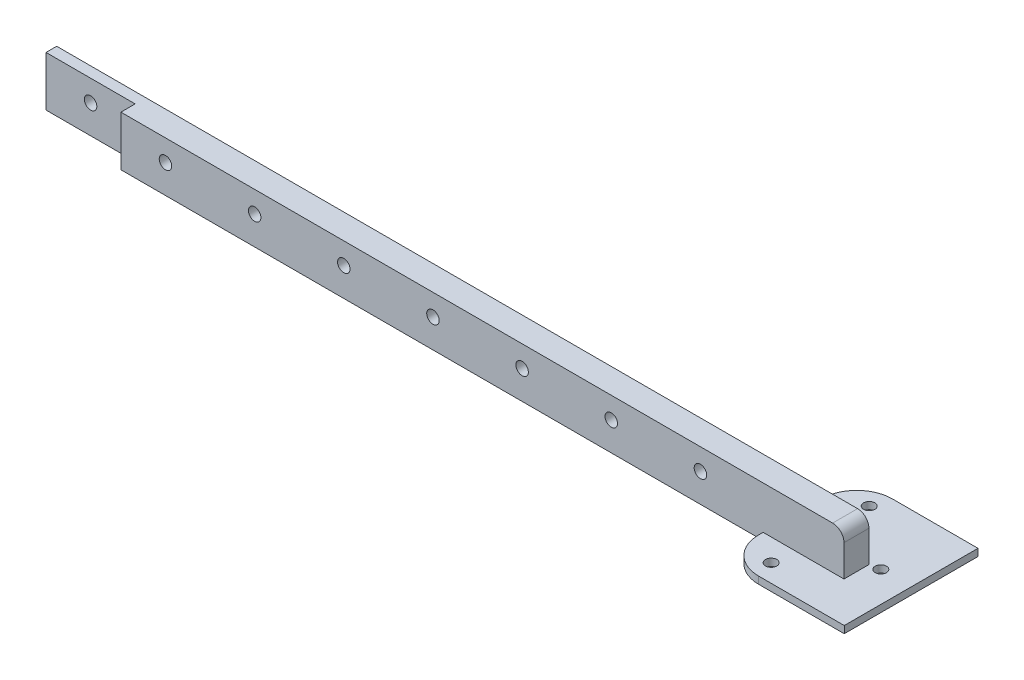
ISO-10303-21;
HEADER;
FILE_DESCRIPTION(('STEP AP214'),'2;1');
FILE_NAME('part.step','',(''),(''),'','','');
FILE_SCHEMA(('AUTOMOTIVE_DESIGN { 1 0 10303 214 1 1 1 1 }'));
ENDSEC;
DATA;
#1=APPLICATION_CONTEXT('core data for automotive mechanical design processes');
#2=APPLICATION_PROTOCOL_DEFINITION('international standard','automotive_design',2000,#1);
#3=PRODUCT_CONTEXT('',#1,'mechanical');
#4=PRODUCT('Part','Part','',(#3));
#5=PRODUCT_RELATED_PRODUCT_CATEGORY('part','',(#4));
#6=PRODUCT_DEFINITION_FORMATION('','',#4);
#7=PRODUCT_DEFINITION_CONTEXT('part definition',#1,'design');
#8=PRODUCT_DEFINITION('design','',#6,#7);
#9=PRODUCT_DEFINITION_SHAPE('','',#8);
#10=(LENGTH_UNIT() NAMED_UNIT(*) SI_UNIT(.MILLI.,.METRE.));
#11=(NAMED_UNIT(*) PLANE_ANGLE_UNIT() SI_UNIT($,.RADIAN.));
#12=(NAMED_UNIT(*) SI_UNIT($,.STERADIAN.) SOLID_ANGLE_UNIT());
#13=UNCERTAINTY_MEASURE_WITH_UNIT(LENGTH_MEASURE(1.E-05),#10,'distance_accuracy_value','');
#14=(GEOMETRIC_REPRESENTATION_CONTEXT(3) GLOBAL_UNCERTAINTY_ASSIGNED_CONTEXT((#13)) GLOBAL_UNIT_ASSIGNED_CONTEXT((#10,
#11,#12)) REPRESENTATION_CONTEXT('',''));
#15=CARTESIAN_POINT('',(0.,0.,0.));
#16=DIRECTION('',(0.,0.,1.));
#17=DIRECTION('',(1.,0.,0.));
#18=AXIS2_PLACEMENT_3D('',#15,#16,#17);
#19=CARTESIAN_POINT('',(-205.08,2.,-11.25));
#20=DIRECTION('',(1.,0.,0.));
#21=DIRECTION('',(0.,0.,-1.));
#22=AXIS2_PLACEMENT_3D('',#19,#20,#21);
#23=PLANE('',#22);
#24=DIRECTION('',(0.,-1.,0.));
#25=VECTOR('',#24,1.);
#26=CARTESIAN_POINT('',(-205.08,14.,-15.25));
#27=LINE('',#26,#25);
#28=CARTESIAN_POINT('',(-205.08,14.,-15.25));
#29=VERTEX_POINT('',#28);
#30=CARTESIAN_POINT('',(-205.08,0.,-15.25));
#31=VERTEX_POINT('',#30);
#32=EDGE_CURVE('E147',#29,#31,#27,.T.);
#33=ORIENTED_EDGE('',*,*,#32,.F.);
#34=DIRECTION('',(0.,0.,1.));
#35=VECTOR('',#34,1.);
#36=CARTESIAN_POINT('',(-205.08,14.,-18.25));
#37=LINE('',#36,#35);
#38=CARTESIAN_POINT('',(-205.08,14.,-18.25));
#39=VERTEX_POINT('',#38);
#40=EDGE_CURVE('E267',#39,#29,#37,.T.);
#41=ORIENTED_EDGE('',*,*,#40,.F.);
#42=DIRECTION('',(0.,-1.,0.));
#43=VECTOR('',#42,1.);
#44=CARTESIAN_POINT('',(-205.08,14.,-18.25));
#45=LINE('',#44,#43);
#46=CARTESIAN_POINT('',(-205.08,2.,-18.25));
#47=VERTEX_POINT('',#46);
#48=EDGE_CURVE('E268',#39,#47,#45,.T.);
#49=ORIENTED_EDGE('',*,*,#48,.T.);
#50=DIRECTION('',(0.,0.,1.));
#51=VECTOR('',#50,1.);
#52=CARTESIAN_POINT('',(-205.08,2.,-11.25));
#53=LINE('',#52,#51);
#54=CARTESIAN_POINT('',(-205.08,2.,-19.25));
#55=VERTEX_POINT('',#54);
#56=EDGE_CURVE('E187',#55,#47,#53,.T.);
#57=ORIENTED_EDGE('',*,*,#56,.F.);
#58=DIRECTION('',(0.,-1.,0.));
#59=VECTOR('',#58,1.);
#60=CARTESIAN_POINT('',(-205.08,2.,-19.25));
#61=LINE('',#60,#59);
#62=CARTESIAN_POINT('',(-205.08,0.,-19.25));
#63=VERTEX_POINT('',#62);
#64=EDGE_CURVE('E174',#55,#63,#61,.T.);
#65=ORIENTED_EDGE('',*,*,#64,.T.);
#66=DIRECTION('',(0.,0.,1.));
#67=VECTOR('',#66,1.);
#68=CARTESIAN_POINT('',(-205.08,0.,-11.25));
#69=LINE('',#68,#67);
#70=EDGE_CURVE('E167',#63,#31,#69,.T.);
#71=ORIENTED_EDGE('',*,*,#70,.T.);
#72=EDGE_LOOP('',(#33,#41,#49,#57,#65,#71));
#73=FACE_BOUND('',#72,.T.);
#74=ADVANCED_FACE('F36',(#73),#23,.F.);
#75=CARTESIAN_POINT('',(-192.58,8.,-37.5));
#76=DIRECTION('',(0.,0.,1.));
#77=DIRECTION('',(1.,0.,0.));
#78=AXIS2_PLACEMENT_3D('',#75,#76,#77);
#79=CYLINDRICAL_SURFACE('',#78,1.75000000000001);
#80=CARTESIAN_POINT('',(-192.58,8.,-18.25));
#81=DIRECTION('',(0.,0.,1.));
#82=DIRECTION('',(1.,0.,0.));
#83=AXIS2_PLACEMENT_3D('',#80,#81,#82);
#84=CIRCLE('',#83,1.75000000000001);
#85=CARTESIAN_POINT('',(-190.83,8.,-18.25));
#86=VERTEX_POINT('',#85);
#87=EDGE_CURVE('E239',#86,#86,#84,.T.);
#88=ORIENTED_EDGE('',*,*,#87,.F.);
#89=EDGE_LOOP('',(#88));
#90=FACE_BOUND('',#89,.T.);
#91=CARTESIAN_POINT('',(-192.58,8.,-15.25));
#92=DIRECTION('',(0.,0.,1.));
#93=DIRECTION('',(1.,0.,0.));
#94=AXIS2_PLACEMENT_3D('',#91,#92,#93);
#95=CIRCLE('',#94,1.75000000000001);
#96=CARTESIAN_POINT('',(-190.83,8.,-15.25));
#97=VERTEX_POINT('',#96);
#98=EDGE_CURVE('E243',#97,#97,#95,.F.);
#99=ORIENTED_EDGE('',*,*,#98,.F.);
#100=EDGE_LOOP('',(#99));
#101=FACE_BOUND('',#100,.T.);
#102=ADVANCED_FACE('F402',(#90,#101),#79,.F.);
#103=CARTESIAN_POINT('',(0.,2.,0.));
#104=DIRECTION('',(0.,1.,0.));
#105=DIRECTION('',(0.,0.,1.));
#106=AXIS2_PLACEMENT_3D('',#103,#104,#105);
#107=PLANE('',#106);
#108=DIRECTION('',(-1.,0.,0.));
#109=VECTOR('',#108,1.);
#110=CARTESIAN_POINT('',(-205.08,2.,-18.25));
#111=LINE('',#110,#109);
#112=CARTESIAN_POINT('',(22.6666666666667,2.,-18.25));
#113=VERTEX_POINT('',#112);
#114=EDGE_CURVE('E264',#113,#47,#111,.T.);
#115=ORIENTED_EDGE('',*,*,#114,.F.);
#116=DIRECTION('',(0.,0.,-1.));
#117=VECTOR('',#116,1.);
#118=CARTESIAN_POINT('',(22.6666666666667,2.,-18.25));
#119=LINE('',#118,#117);
#120=CARTESIAN_POINT('',(22.6666666666667,2.,-11.25));
#121=VERTEX_POINT('',#120);
#122=EDGE_CURVE('E242',#121,#113,#119,.T.);
#123=ORIENTED_EDGE('',*,*,#122,.F.);
#124=DIRECTION('',(1.,0.,0.));
#125=VECTOR('',#124,1.);
#126=CARTESIAN_POINT('',(-205.08,2.,-11.25));
#127=LINE('',#126,#125);
#128=CARTESIAN_POINT('',(0.,2.,-11.25));
#129=VERTEX_POINT('',#128);
#130=EDGE_CURVE('E216',#129,#121,#127,.T.);
#131=ORIENTED_EDGE('',*,*,#130,.F.);
#132=DIRECTION('',(0.,0.,1.));
#133=VECTOR('',#132,1.);
#134=CARTESIAN_POINT('',(0.,2.,-11.25));
#135=LINE('',#134,#133);
#136=CARTESIAN_POINT('',(0.,2.,-10.));
#137=VERTEX_POINT('',#136);
#138=EDGE_CURVE('E178',#129,#137,#135,.T.);
#139=ORIENTED_EDGE('',*,*,#138,.T.);
#140=CARTESIAN_POINT('',(10.,2.,-10.));
#141=DIRECTION('',(0.,1.,0.));
#142=DIRECTION('',(0.,0.,1.));
#143=AXIS2_PLACEMENT_3D('',#140,#141,#142);
#144=CIRCLE('',#143,10.);
#145=CARTESIAN_POINT('',(10.,2.,0.));
#146=VERTEX_POINT('',#145);
#147=EDGE_CURVE('E209',#137,#146,#144,.T.);
#148=ORIENTED_EDGE('',*,*,#147,.T.);
#149=DIRECTION('',(1.,0.,0.));
#150=VECTOR('',#149,1.);
#151=CARTESIAN_POINT('',(0.,2.,0.));
#152=LINE('',#151,#150);
#153=CARTESIAN_POINT('',(34.,2.,0.));
#154=VERTEX_POINT('',#153);
#155=EDGE_CURVE('E296',#146,#154,#152,.T.);
#156=ORIENTED_EDGE('',*,*,#155,.T.);
#157=DIRECTION('',(0.,0.,-1.));
#158=VECTOR('',#157,1.);
#159=CARTESIAN_POINT('',(34.,2.,0.));
#160=LINE('',#159,#158);
#161=CARTESIAN_POINT('',(34.,2.,-37.5));
#162=VERTEX_POINT('',#161);
#163=EDGE_CURVE('E298',#154,#162,#160,.T.);
#164=ORIENTED_EDGE('',*,*,#163,.T.);
#165=DIRECTION('',(-1.,0.,0.));
#166=VECTOR('',#165,1.);
#167=CARTESIAN_POINT('',(34.,2.,-37.5));
#168=LINE('',#167,#166);
#169=CARTESIAN_POINT('',(10.,2.,-37.5));
#170=VERTEX_POINT('',#169);
#171=EDGE_CURVE('E300',#162,#170,#168,.T.);
#172=ORIENTED_EDGE('',*,*,#171,.T.);
#173=CARTESIAN_POINT('',(10.,2.,-27.5));
#174=DIRECTION('',(0.,1.,0.));
#175=DIRECTION('',(0.,0.,1.));
#176=AXIS2_PLACEMENT_3D('',#173,#174,#175);
#177=CIRCLE('',#176,10.);
#178=CARTESIAN_POINT('',(0.,2.,-27.5));
#179=VERTEX_POINT('',#178);
#180=EDGE_CURVE('E207',#170,#179,#177,.T.);
#181=ORIENTED_EDGE('',*,*,#180,.T.);
#182=DIRECTION('',(0.,0.,1.));
#183=VECTOR('',#182,1.);
#184=CARTESIAN_POINT('',(0.,2.,-37.5));
#185=LINE('',#184,#183);
#186=CARTESIAN_POINT('',(0.,2.,-19.25));
#187=VERTEX_POINT('',#186);
#188=EDGE_CURVE('E303',#179,#187,#185,.T.);
#189=ORIENTED_EDGE('',*,*,#188,.T.);
#190=DIRECTION('',(-1.,0.,0.));
#191=VECTOR('',#190,1.);
#192=CARTESIAN_POINT('',(-205.08,2.,-19.25));
#193=LINE('',#192,#191);
#194=EDGE_CURVE('E305',#187,#55,#193,.T.);
#195=ORIENTED_EDGE('',*,*,#194,.T.);
#196=ORIENTED_EDGE('',*,*,#56,.T.);
#197=EDGE_LOOP('',(#115,#123,#131,#139,#148,#156,#164,#172,#181,#189,#195,#196));
#198=FACE_BOUND('',#197,.T.);
#199=CARTESIAN_POINT('',(8.5,2.,-5.));
#200=DIRECTION('',(0.,1.,0.));
#201=DIRECTION('',(0.,0.,1.));
#202=AXIS2_PLACEMENT_3D('',#199,#200,#201);
#203=CIRCLE('',#202,1.59);
#204=CARTESIAN_POINT('',(8.5,2.,-3.41));
#205=VERTEX_POINT('',#204);
#206=EDGE_CURVE('E282',#205,#205,#203,.T.);
#207=ORIENTED_EDGE('',*,*,#206,.F.);
#208=EDGE_LOOP('',(#207));
#209=FACE_BOUND('',#208,.T.);
#210=CARTESIAN_POINT('',(8.5,2.,-32.5));
#211=DIRECTION('',(0.,1.,0.));
#212=DIRECTION('',(0.,0.,1.));
#213=AXIS2_PLACEMENT_3D('',#210,#211,#212);
#214=CIRCLE('',#213,1.59);
#215=CARTESIAN_POINT('',(8.5,2.,-30.91));
#216=VERTEX_POINT('',#215);
#217=EDGE_CURVE('E288',#216,#216,#214,.T.);
#218=ORIENTED_EDGE('',*,*,#217,.F.);
#219=EDGE_LOOP('',(#218));
#220=FACE_BOUND('',#219,.T.);
#221=CARTESIAN_POINT('',(25.5,2.,-18.75));
#222=DIRECTION('',(0.,1.,0.));
#223=DIRECTION('',(0.,0.,1.));
#224=AXIS2_PLACEMENT_3D('',#221,#222,#223);
#225=CIRCLE('',#224,1.59);
#226=CARTESIAN_POINT('',(25.5,2.,-17.16));
#227=VERTEX_POINT('',#226);
#228=EDGE_CURVE('E276',#227,#227,#225,.T.);
#229=ORIENTED_EDGE('',*,*,#228,.F.);
#230=EDGE_LOOP('',(#229));
#231=FACE_BOUND('',#230,.T.);
#232=ADVANCED_FACE('F327',(#198,#209,#220,#231),#107,.T.);
#233=CARTESIAN_POINT('',(0.,0.,0.));
#234=DIRECTION('',(0.,1.,0.));
#235=DIRECTION('',(0.,0.,1.));
#236=AXIS2_PLACEMENT_3D('',#233,#234,#235);
#237=PLANE('',#236);
#238=DIRECTION('',(1.,0.,0.));
#239=VECTOR('',#238,1.);
#240=CARTESIAN_POINT('',(0.,0.,-11.25));
#241=LINE('',#240,#239);
#242=CARTESIAN_POINT('',(-180.08,0.,-11.25));
#243=VERTEX_POINT('',#242);
#244=CARTESIAN_POINT('',(0.,0.,-11.25));
#245=VERTEX_POINT('',#244);
#246=EDGE_CURVE('E175',#243,#245,#241,.T.);
#247=ORIENTED_EDGE('',*,*,#246,.F.);
#248=DIRECTION('',(0.,0.,1.));
#249=VECTOR('',#248,1.);
#250=CARTESIAN_POINT('',(-180.08,0.,-15.25));
#251=LINE('',#250,#249);
#252=CARTESIAN_POINT('',(-180.08,0.,-15.25));
#253=VERTEX_POINT('',#252);
#254=EDGE_CURVE('E168',#253,#243,#251,.T.);
#255=ORIENTED_EDGE('',*,*,#254,.F.);
#256=DIRECTION('',(1.,0.,0.));
#257=VECTOR('',#256,1.);
#258=CARTESIAN_POINT('',(-205.08,0.,-15.25));
#259=LINE('',#258,#257);
#260=EDGE_CURVE('E151',#31,#253,#259,.T.);
#261=ORIENTED_EDGE('',*,*,#260,.F.);
#262=ORIENTED_EDGE('',*,*,#70,.F.);
#263=DIRECTION('',(-1.,0.,0.));
#264=VECTOR('',#263,1.);
#265=CARTESIAN_POINT('',(-205.08,0.,-19.25));
#266=LINE('',#265,#264);
#267=CARTESIAN_POINT('',(0.,0.,-19.25));
#268=VERTEX_POINT('',#267);
#269=EDGE_CURVE('E176',#268,#63,#266,.T.);
#270=ORIENTED_EDGE('',*,*,#269,.F.);
#271=DIRECTION('',(0.,0.,1.));
#272=VECTOR('',#271,1.);
#273=CARTESIAN_POINT('',(0.,0.,-37.5));
#274=LINE('',#273,#272);
#275=CARTESIAN_POINT('',(0.,0.,-27.5));
#276=VERTEX_POINT('',#275);
#277=EDGE_CURVE('E180',#276,#268,#274,.T.);
#278=ORIENTED_EDGE('',*,*,#277,.F.);
#279=CARTESIAN_POINT('',(10.,0.,-27.5));
#280=DIRECTION('',(0.,1.,0.));
#281=DIRECTION('',(0.,0.,1.));
#282=AXIS2_PLACEMENT_3D('',#279,#280,#281);
#283=CIRCLE('',#282,10.);
#284=CARTESIAN_POINT('',(10.,0.,-37.5));
#285=VERTEX_POINT('',#284);
#286=EDGE_CURVE('E201',#276,#285,#283,.F.);
#287=ORIENTED_EDGE('',*,*,#286,.T.);
#288=DIRECTION('',(-1.,0.,0.));
#289=VECTOR('',#288,1.);
#290=CARTESIAN_POINT('',(34.,0.,-37.5));
#291=LINE('',#290,#289);
#292=CARTESIAN_POINT('',(34.,0.,-37.5));
#293=VERTEX_POINT('',#292);
#294=EDGE_CURVE('E314',#293,#285,#291,.T.);
#295=ORIENTED_EDGE('',*,*,#294,.F.);
#296=DIRECTION('',(0.,0.,-1.));
#297=VECTOR('',#296,1.);
#298=CARTESIAN_POINT('',(34.,0.,0.));
#299=LINE('',#298,#297);
#300=CARTESIAN_POINT('',(34.,0.,0.));
#301=VERTEX_POINT('',#300);
#302=EDGE_CURVE('E312',#301,#293,#299,.T.);
#303=ORIENTED_EDGE('',*,*,#302,.F.);
#304=DIRECTION('',(1.,0.,0.));
#305=VECTOR('',#304,1.);
#306=CARTESIAN_POINT('',(0.,0.,0.));
#307=LINE('',#306,#305);
#308=CARTESIAN_POINT('',(10.,0.,0.));
#309=VERTEX_POINT('',#308);
#310=EDGE_CURVE('E310',#309,#301,#307,.T.);
#311=ORIENTED_EDGE('',*,*,#310,.F.);
#312=CARTESIAN_POINT('',(10.,0.,-10.));
#313=DIRECTION('',(0.,1.,0.));
#314=DIRECTION('',(0.,0.,1.));
#315=AXIS2_PLACEMENT_3D('',#312,#313,#314);
#316=CIRCLE('',#315,10.);
#317=CARTESIAN_POINT('',(0.,0.,-10.));
#318=VERTEX_POINT('',#317);
#319=EDGE_CURVE('E203',#309,#318,#316,.F.);
#320=ORIENTED_EDGE('',*,*,#319,.T.);
#321=DIRECTION('',(0.,0.,1.));
#322=VECTOR('',#321,1.);
#323=CARTESIAN_POINT('',(0.,0.,-11.25));
#324=LINE('',#323,#322);
#325=EDGE_CURVE('E291',#245,#318,#324,.T.);
#326=ORIENTED_EDGE('',*,*,#325,.F.);
#327=EDGE_LOOP('',(#247,#255,#261,#262,#270,#278,#287,#295,#303,#311,#320,#326));
#328=FACE_BOUND('',#327,.T.);
#329=CARTESIAN_POINT('',(8.5,0.,-32.5));
#330=DIRECTION('',(0.,1.,0.));
#331=DIRECTION('',(0.,0.,1.));
#332=AXIS2_PLACEMENT_3D('',#329,#330,#331);
#333=CIRCLE('',#332,1.59);
#334=CARTESIAN_POINT('',(8.5,0.,-30.91));
#335=VERTEX_POINT('',#334);
#336=EDGE_CURVE('E285',#335,#335,#333,.T.);
#337=ORIENTED_EDGE('',*,*,#336,.T.);
#338=EDGE_LOOP('',(#337));
#339=FACE_BOUND('',#338,.T.);
#340=CARTESIAN_POINT('',(8.5,0.,-5.));
#341=DIRECTION('',(0.,1.,0.));
#342=DIRECTION('',(0.,0.,1.));
#343=AXIS2_PLACEMENT_3D('',#340,#341,#342);
#344=CIRCLE('',#343,1.59);
#345=CARTESIAN_POINT('',(8.5,0.,-3.41));
#346=VERTEX_POINT('',#345);
#347=EDGE_CURVE('E279',#346,#346,#344,.T.);
#348=ORIENTED_EDGE('',*,*,#347,.T.);
#349=EDGE_LOOP('',(#348));
#350=FACE_BOUND('',#349,.T.);
#351=CARTESIAN_POINT('',(25.5,0.,-18.75));
#352=DIRECTION('',(0.,1.,0.));
#353=DIRECTION('',(0.,0.,1.));
#354=AXIS2_PLACEMENT_3D('',#351,#352,#353);
#355=CIRCLE('',#354,1.59);
#356=CARTESIAN_POINT('',(25.5,0.,-17.16));
#357=VERTEX_POINT('',#356);
#358=EDGE_CURVE('E275',#357,#357,#355,.T.);
#359=ORIENTED_EDGE('',*,*,#358,.T.);
#360=EDGE_LOOP('',(#359));
#361=FACE_BOUND('',#360,.T.);
#362=ADVANCED_FACE('F164',(#328,#339,#350,#361),#237,.F.);
#363=CARTESIAN_POINT('',(0.,2.,-11.25));
#364=DIRECTION('',(1.,0.,0.));
#365=DIRECTION('',(0.,0.,-1.));
#366=AXIS2_PLACEMENT_3D('',#363,#364,#365);
#367=PLANE('',#366);
#368=ORIENTED_EDGE('',*,*,#325,.T.);
#369=DIRECTION('',(0.,-1.,0.));
#370=VECTOR('',#369,1.);
#371=CARTESIAN_POINT('',(0.,2.,-10.));
#372=LINE('',#371,#370);
#373=EDGE_CURVE('E205',#318,#137,#372,.F.);
#374=ORIENTED_EDGE('',*,*,#373,.T.);
#375=ORIENTED_EDGE('',*,*,#138,.F.);
#376=DIRECTION('',(0.,-1.,0.));
#377=VECTOR('',#376,1.);
#378=CARTESIAN_POINT('',(0.,2.,-11.25));
#379=LINE('',#378,#377);
#380=EDGE_CURVE('E184',#129,#245,#379,.T.);
#381=ORIENTED_EDGE('',*,*,#380,.T.);
#382=EDGE_LOOP('',(#368,#374,#375,#381));
#383=FACE_BOUND('',#382,.T.);
#384=ADVANCED_FACE('F355',(#383),#367,.F.);
#385=CARTESIAN_POINT('',(0.,2.,0.));
#386=DIRECTION('',(0.,0.,-1.));
#387=DIRECTION('',(-1.,0.,0.));
#388=AXIS2_PLACEMENT_3D('',#385,#386,#387);
#389=PLANE('',#388);
#390=ORIENTED_EDGE('',*,*,#155,.F.);
#391=DIRECTION('',(0.,-1.,0.));
#392=VECTOR('',#391,1.);
#393=CARTESIAN_POINT('',(10.,2.,0.));
#394=LINE('',#393,#392);
#395=EDGE_CURVE('E198',#146,#309,#394,.T.);
#396=ORIENTED_EDGE('',*,*,#395,.T.);
#397=ORIENTED_EDGE('',*,*,#310,.T.);
#398=DIRECTION('',(0.,-1.,0.));
#399=VECTOR('',#398,1.);
#400=CARTESIAN_POINT('',(34.,2.,0.));
#401=LINE('',#400,#399);
#402=EDGE_CURVE('E195',#154,#301,#401,.T.);
#403=ORIENTED_EDGE('',*,*,#402,.F.);
#404=EDGE_LOOP('',(#390,#396,#397,#403));
#405=FACE_BOUND('',#404,.T.);
#406=ADVANCED_FACE('F347',(#405),#389,.F.);
#407=CARTESIAN_POINT('',(34.,2.,0.));
#408=DIRECTION('',(-1.,0.,0.));
#409=DIRECTION('',(0.,0.,1.));
#410=AXIS2_PLACEMENT_3D('',#407,#408,#409);
#411=PLANE('',#410);
#412=ORIENTED_EDGE('',*,*,#302,.T.);
#413=DIRECTION('',(0.,-1.,0.));
#414=VECTOR('',#413,1.);
#415=CARTESIAN_POINT('',(34.,2.,-37.5));
#416=LINE('',#415,#414);
#417=EDGE_CURVE('E192',#162,#293,#416,.T.);
#418=ORIENTED_EDGE('',*,*,#417,.F.);
#419=ORIENTED_EDGE('',*,*,#163,.F.);
#420=ORIENTED_EDGE('',*,*,#402,.T.);
#421=EDGE_LOOP('',(#412,#418,#419,#420));
#422=FACE_BOUND('',#421,.T.);
#423=ADVANCED_FACE('F341',(#422),#411,.F.);
#424=CARTESIAN_POINT('',(34.,2.,-37.5));
#425=DIRECTION('',(0.,0.,1.));
#426=DIRECTION('',(1.,0.,0.));
#427=AXIS2_PLACEMENT_3D('',#424,#425,#426);
#428=PLANE('',#427);
#429=ORIENTED_EDGE('',*,*,#294,.T.);
#430=DIRECTION('',(0.,-1.,0.));
#431=VECTOR('',#430,1.);
#432=CARTESIAN_POINT('',(10.,2.,-37.5));
#433=LINE('',#432,#431);
#434=EDGE_CURVE('E214',#285,#170,#433,.F.);
#435=ORIENTED_EDGE('',*,*,#434,.T.);
#436=ORIENTED_EDGE('',*,*,#171,.F.);
#437=ORIENTED_EDGE('',*,*,#417,.T.);
#438=EDGE_LOOP('',(#429,#435,#436,#437));
#439=FACE_BOUND('',#438,.T.);
#440=ADVANCED_FACE('F336',(#439),#428,.F.);
#441=CARTESIAN_POINT('',(0.,2.,-37.5));
#442=DIRECTION('',(1.,0.,0.));
#443=DIRECTION('',(0.,0.,-1.));
#444=AXIS2_PLACEMENT_3D('',#441,#442,#443);
#445=PLANE('',#444);
#446=ORIENTED_EDGE('',*,*,#188,.F.);
#447=DIRECTION('',(0.,-1.,0.));
#448=VECTOR('',#447,1.);
#449=CARTESIAN_POINT('',(0.,2.,-27.5));
#450=LINE('',#449,#448);
#451=EDGE_CURVE('E211',#179,#276,#450,.T.);
#452=ORIENTED_EDGE('',*,*,#451,.T.);
#453=ORIENTED_EDGE('',*,*,#277,.T.);
#454=DIRECTION('',(0.,-1.,0.));
#455=VECTOR('',#454,1.);
#456=CARTESIAN_POINT('',(0.,2.,-19.25));
#457=LINE('',#456,#455);
#458=EDGE_CURVE('E189',#187,#268,#457,.T.);
#459=ORIENTED_EDGE('',*,*,#458,.F.);
#460=EDGE_LOOP('',(#446,#452,#453,#459));
#461=FACE_BOUND('',#460,.T.);
#462=ADVANCED_FACE('F320',(#461),#445,.F.);
#463=CARTESIAN_POINT('',(-205.08,2.,-19.25));
#464=DIRECTION('',(0.,0.,1.));
#465=DIRECTION('',(1.,0.,0.));
#466=AXIS2_PLACEMENT_3D('',#463,#464,#465);
#467=PLANE('',#466);
#468=ORIENTED_EDGE('',*,*,#269,.T.);
#469=ORIENTED_EDGE('',*,*,#64,.F.);
#470=ORIENTED_EDGE('',*,*,#194,.F.);
#471=ORIENTED_EDGE('',*,*,#458,.T.);
#472=EDGE_LOOP('',(#468,#469,#470,#471));
#473=FACE_BOUND('',#472,.T.);
#474=ADVANCED_FACE('F324',(#473),#467,.F.);
#475=CARTESIAN_POINT('',(0.,2.,-11.25));
#476=DIRECTION('',(0.,0.,-1.));
#477=DIRECTION('',(-1.,0.,0.));
#478=AXIS2_PLACEMENT_3D('',#475,#476,#477);
#479=PLANE('',#478);
#480=CARTESIAN_POINT('',(-167.58,8.,-11.25));
#481=DIRECTION('',(0.,0.,1.));
#482=DIRECTION('',(1.,0.,0.));
#483=AXIS2_PLACEMENT_3D('',#480,#481,#482);
#484=CIRCLE('',#483,1.75000000000001);
#485=CARTESIAN_POINT('',(-165.83,8.,-11.25));
#486=VERTEX_POINT('',#485);
#487=EDGE_CURVE('E221',#486,#486,#484,.T.);
#488=ORIENTED_EDGE('',*,*,#487,.F.);
#489=EDGE_LOOP('',(#488));
#490=FACE_BOUND('',#489,.T.);
#491=CARTESIAN_POINT('',(-142.58,8.,-11.25));
#492=DIRECTION('',(0.,0.,1.));
#493=DIRECTION('',(1.,0.,0.));
#494=AXIS2_PLACEMENT_3D('',#491,#492,#493);
#495=CIRCLE('',#494,1.74999999999998);
#496=CARTESIAN_POINT('',(-140.83,8.,-11.25));
#497=VERTEX_POINT('',#496);
#498=EDGE_CURVE('E372',#497,#497,#495,.T.);
#499=ORIENTED_EDGE('',*,*,#498,.F.);
#500=EDGE_LOOP('',(#499));
#501=FACE_BOUND('',#500,.T.);
#502=CARTESIAN_POINT('',(-117.58,8.,-11.25));
#503=DIRECTION('',(0.,0.,1.));
#504=DIRECTION('',(1.,0.,0.));
#505=AXIS2_PLACEMENT_3D('',#502,#503,#504);
#506=CIRCLE('',#505,1.75000000000001);
#507=CARTESIAN_POINT('',(-115.83,8.,-11.25));
#508=VERTEX_POINT('',#507);
#509=EDGE_CURVE('E375',#508,#508,#506,.T.);
#510=ORIENTED_EDGE('',*,*,#509,.F.);
#511=EDGE_LOOP('',(#510));
#512=FACE_BOUND('',#511,.T.);
#513=CARTESIAN_POINT('',(-92.58,8.,-11.25));
#514=DIRECTION('',(0.,0.,1.));
#515=DIRECTION('',(1.,0.,0.));
#516=AXIS2_PLACEMENT_3D('',#513,#514,#515);
#517=CIRCLE('',#516,1.75000000000001);
#518=CARTESIAN_POINT('',(-90.83,8.,-11.25));
#519=VERTEX_POINT('',#518);
#520=EDGE_CURVE('E378',#519,#519,#517,.T.);
#521=ORIENTED_EDGE('',*,*,#520,.F.);
#522=EDGE_LOOP('',(#521));
#523=FACE_BOUND('',#522,.T.);
#524=CARTESIAN_POINT('',(-67.58,8.,-11.25));
#525=DIRECTION('',(0.,0.,1.));
#526=DIRECTION('',(1.,0.,0.));
#527=AXIS2_PLACEMENT_3D('',#524,#525,#526);
#528=CIRCLE('',#527,1.75000000000001);
#529=CARTESIAN_POINT('',(-65.83,8.,-11.25));
#530=VERTEX_POINT('',#529);
#531=EDGE_CURVE('E381',#530,#530,#528,.T.);
#532=ORIENTED_EDGE('',*,*,#531,.F.);
#533=EDGE_LOOP('',(#532));
#534=FACE_BOUND('',#533,.T.);
#535=CARTESIAN_POINT('',(-42.58,8.,-11.25));
#536=DIRECTION('',(0.,0.,1.));
#537=DIRECTION('',(1.,0.,0.));
#538=AXIS2_PLACEMENT_3D('',#535,#536,#537);
#539=CIRCLE('',#538,1.75000000000001);
#540=CARTESIAN_POINT('',(-40.83,8.,-11.25));
#541=VERTEX_POINT('',#540);
#542=EDGE_CURVE('E384',#541,#541,#539,.T.);
#543=ORIENTED_EDGE('',*,*,#542,.F.);
#544=EDGE_LOOP('',(#543));
#545=FACE_BOUND('',#544,.T.);
#546=CARTESIAN_POINT('',(-17.58,8.,-11.25));
#547=DIRECTION('',(0.,0.,1.));
#548=DIRECTION('',(1.,0.,0.));
#549=AXIS2_PLACEMENT_3D('',#546,#547,#548);
#550=CIRCLE('',#549,1.75000000000001);
#551=CARTESIAN_POINT('',(-15.83,8.,-11.25));
#552=VERTEX_POINT('',#551);
#553=EDGE_CURVE('E246',#552,#552,#550,.T.);
#554=ORIENTED_EDGE('',*,*,#553,.F.);
#555=EDGE_LOOP('',(#554));
#556=FACE_BOUND('',#555,.T.);
#557=DIRECTION('',(0.,-1.,0.));
#558=VECTOR('',#557,1.);
#559=CARTESIAN_POINT('',(22.6666666666667,14.,-11.25));
#560=LINE('',#559,#558);
#561=CARTESIAN_POINT('',(22.6666666666667,10.825,-11.25));
#562=VERTEX_POINT('',#561);
#563=EDGE_CURVE('E273',#562,#121,#560,.T.);
#564=ORIENTED_EDGE('',*,*,#563,.F.);
#565=CARTESIAN_POINT('',(19.4916666666667,10.825,-11.25));
#566=DIRECTION('',(0.,0.,-1.));
#567=DIRECTION('',(-1.,0.,0.));
#568=AXIS2_PLACEMENT_3D('',#565,#566,#567);
#569=CIRCLE('',#568,3.175);
#570=CARTESIAN_POINT('',(19.4916666666666,14.,-11.25));
#571=VERTEX_POINT('',#570);
#572=EDGE_CURVE('E11',#562,#571,#569,.F.);
#573=ORIENTED_EDGE('',*,*,#572,.T.);
#574=DIRECTION('',(1.,0.,0.));
#575=VECTOR('',#574,1.);
#576=CARTESIAN_POINT('',(-205.08,14.,-11.25));
#577=LINE('',#576,#575);
#578=CARTESIAN_POINT('',(-180.08,14.,-11.25));
#579=VERTEX_POINT('',#578);
#580=EDGE_CURVE('E360',#579,#571,#577,.T.);
#581=ORIENTED_EDGE('',*,*,#580,.F.);
#582=DIRECTION('',(0.,1.,0.));
#583=VECTOR('',#582,1.);
#584=CARTESIAN_POINT('',(-180.08,14.,-11.25));
#585=LINE('',#584,#583);
#586=EDGE_CURVE('E159',#243,#579,#585,.T.);
#587=ORIENTED_EDGE('',*,*,#586,.F.);
#588=ORIENTED_EDGE('',*,*,#246,.T.);
#589=ORIENTED_EDGE('',*,*,#380,.F.);
#590=ORIENTED_EDGE('',*,*,#130,.T.);
#591=EDGE_LOOP('',(#564,#573,#581,#587,#588,#589,#590));
#592=FACE_BOUND('',#591,.T.);
#593=ADVANCED_FACE('F357',(#490,#501,#512,#523,#534,#545,#556,#592),#479,.F.);
#594=CARTESIAN_POINT('',(8.5,2.,-32.5));
#595=DIRECTION('',(0.,-1.,0.));
#596=DIRECTION('',(0.,0.,-1.));
#597=AXIS2_PLACEMENT_3D('',#594,#595,#596);
#598=CYLINDRICAL_SURFACE('',#597,1.59);
#599=ORIENTED_EDGE('',*,*,#217,.T.);
#600=EDGE_LOOP('',(#599));
#601=FACE_BOUND('',#600,.T.);
#602=ORIENTED_EDGE('',*,*,#336,.F.);
#603=EDGE_LOOP('',(#602));
#604=FACE_BOUND('',#603,.T.);
#605=ADVANCED_FACE('F444',(#601,#604),#598,.F.);
#606=CARTESIAN_POINT('',(8.5,2.,-5.));
#607=DIRECTION('',(0.,-1.,0.));
#608=DIRECTION('',(0.,0.,-1.));
#609=AXIS2_PLACEMENT_3D('',#606,#607,#608);
#610=CYLINDRICAL_SURFACE('',#609,1.59);
#611=ORIENTED_EDGE('',*,*,#206,.T.);
#612=EDGE_LOOP('',(#611));
#613=FACE_BOUND('',#612,.T.);
#614=ORIENTED_EDGE('',*,*,#347,.F.);
#615=EDGE_LOOP('',(#614));
#616=FACE_BOUND('',#615,.T.);
#617=ADVANCED_FACE('F440',(#613,#616),#610,.F.);
#618=CARTESIAN_POINT('',(25.5,2.,-18.75));
#619=DIRECTION('',(0.,-1.,0.));
#620=DIRECTION('',(0.,0.,-1.));
#621=AXIS2_PLACEMENT_3D('',#618,#619,#620);
#622=CYLINDRICAL_SURFACE('',#621,1.59);
#623=ORIENTED_EDGE('',*,*,#228,.T.);
#624=EDGE_LOOP('',(#623));
#625=FACE_BOUND('',#624,.T.);
#626=ORIENTED_EDGE('',*,*,#358,.F.);
#627=EDGE_LOOP('',(#626));
#628=FACE_BOUND('',#627,.T.);
#629=ADVANCED_FACE('F425',(#625,#628),#622,.F.);
#630=CARTESIAN_POINT('',(10.,2.,-10.));
#631=DIRECTION('',(0.,-1.,0.));
#632=DIRECTION('',(0.,0.,-1.));
#633=AXIS2_PLACEMENT_3D('',#630,#631,#632);
#634=CYLINDRICAL_SURFACE('',#633,10.);
#635=ORIENTED_EDGE('',*,*,#147,.F.);
#636=ORIENTED_EDGE('',*,*,#373,.F.);
#637=ORIENTED_EDGE('',*,*,#319,.F.);
#638=ORIENTED_EDGE('',*,*,#395,.F.);
#639=EDGE_LOOP('',(#635,#636,#637,#638));
#640=FACE_BOUND('',#639,.T.);
#641=ADVANCED_FACE('F351',(#640),#634,.T.);
#642=CARTESIAN_POINT('',(10.,2.,-27.5));
#643=DIRECTION('',(0.,-1.,0.));
#644=DIRECTION('',(0.,0.,-1.));
#645=AXIS2_PLACEMENT_3D('',#642,#643,#644);
#646=CYLINDRICAL_SURFACE('',#645,10.);
#647=ORIENTED_EDGE('',*,*,#180,.F.);
#648=ORIENTED_EDGE('',*,*,#434,.F.);
#649=ORIENTED_EDGE('',*,*,#286,.F.);
#650=ORIENTED_EDGE('',*,*,#451,.F.);
#651=EDGE_LOOP('',(#647,#648,#649,#650));
#652=FACE_BOUND('',#651,.T.);
#653=ADVANCED_FACE('F331',(#652),#646,.T.);
#654=CARTESIAN_POINT('',(22.6666666666667,14.,-18.25));
#655=DIRECTION('',(-1.,0.,0.));
#656=DIRECTION('',(0.,0.,1.));
#657=AXIS2_PLACEMENT_3D('',#654,#655,#656);
#658=PLANE('',#657);
#659=DIRECTION('',(0.,-1.,0.));
#660=VECTOR('',#659,1.);
#661=CARTESIAN_POINT('',(22.6666666666667,14.,-18.25));
#662=LINE('',#661,#660);
#663=CARTESIAN_POINT('',(22.6666666666667,10.825,-18.25));
#664=VERTEX_POINT('',#663);
#665=EDGE_CURVE('E271',#664,#113,#662,.T.);
#666=ORIENTED_EDGE('',*,*,#665,.F.);
#667=DIRECTION('',(0.,0.,-1.));
#668=VECTOR('',#667,1.);
#669=CARTESIAN_POINT('',(22.6666666666667,10.825,-11.25));
#670=LINE('',#669,#668);
#671=EDGE_CURVE('E44',#664,#562,#670,.F.);
#672=ORIENTED_EDGE('',*,*,#671,.T.);
#673=ORIENTED_EDGE('',*,*,#563,.T.);
#674=ORIENTED_EDGE('',*,*,#122,.T.);
#675=EDGE_LOOP('',(#666,#672,#673,#674));
#676=FACE_BOUND('',#675,.T.);
#677=ADVANCED_FACE('F392',(#676),#658,.F.);
#678=CARTESIAN_POINT('',(-205.08,14.,-18.25));
#679=DIRECTION('',(0.,0.,1.));
#680=DIRECTION('',(1.,0.,0.));
#681=AXIS2_PLACEMENT_3D('',#678,#679,#680);
#682=PLANE('',#681);
#683=ORIENTED_EDGE('',*,*,#87,.T.);
#684=EDGE_LOOP('',(#683));
#685=FACE_BOUND('',#684,.T.);
#686=CARTESIAN_POINT('',(-167.58,8.,-18.25));
#687=DIRECTION('',(0.,0.,1.));
#688=DIRECTION('',(1.,0.,0.));
#689=AXIS2_PLACEMENT_3D('',#686,#687,#688);
#690=CIRCLE('',#689,1.75000000000001);
#691=CARTESIAN_POINT('',(-165.83,8.,-18.25));
#692=VERTEX_POINT('',#691);
#693=EDGE_CURVE('E236',#692,#692,#690,.T.);
#694=ORIENTED_EDGE('',*,*,#693,.T.);
#695=EDGE_LOOP('',(#694));
#696=FACE_BOUND('',#695,.T.);
#697=CARTESIAN_POINT('',(-142.58,8.,-18.25));
#698=DIRECTION('',(0.,0.,1.));
#699=DIRECTION('',(1.,0.,0.));
#700=AXIS2_PLACEMENT_3D('',#697,#698,#699);
#701=CIRCLE('',#700,1.74999999999998);
#702=CARTESIAN_POINT('',(-140.83,8.,-18.25));
#703=VERTEX_POINT('',#702);
#704=EDGE_CURVE('E233',#703,#703,#701,.T.);
#705=ORIENTED_EDGE('',*,*,#704,.T.);
#706=EDGE_LOOP('',(#705));
#707=FACE_BOUND('',#706,.T.);
#708=CARTESIAN_POINT('',(-117.58,8.,-18.25));
#709=DIRECTION('',(0.,0.,1.));
#710=DIRECTION('',(1.,0.,0.));
#711=AXIS2_PLACEMENT_3D('',#708,#709,#710);
#712=CIRCLE('',#711,1.75000000000001);
#713=CARTESIAN_POINT('',(-115.83,8.,-18.25));
#714=VERTEX_POINT('',#713);
#715=EDGE_CURVE('E230',#714,#714,#712,.T.);
#716=ORIENTED_EDGE('',*,*,#715,.T.);
#717=EDGE_LOOP('',(#716));
#718=FACE_BOUND('',#717,.T.);
#719=CARTESIAN_POINT('',(-92.58,8.,-18.25));
#720=DIRECTION('',(0.,0.,1.));
#721=DIRECTION('',(1.,0.,0.));
#722=AXIS2_PLACEMENT_3D('',#719,#720,#721);
#723=CIRCLE('',#722,1.75000000000001);
#724=CARTESIAN_POINT('',(-90.83,8.,-18.25));
#725=VERTEX_POINT('',#724);
#726=EDGE_CURVE('E227',#725,#725,#723,.T.);
#727=ORIENTED_EDGE('',*,*,#726,.T.);
#728=EDGE_LOOP('',(#727));
#729=FACE_BOUND('',#728,.T.);
#730=CARTESIAN_POINT('',(-67.58,8.,-18.25));
#731=DIRECTION('',(0.,0.,1.));
#732=DIRECTION('',(1.,0.,0.));
#733=AXIS2_PLACEMENT_3D('',#730,#731,#732);
#734=CIRCLE('',#733,1.75000000000001);
#735=CARTESIAN_POINT('',(-65.83,8.,-18.25));
#736=VERTEX_POINT('',#735);
#737=EDGE_CURVE('E224',#736,#736,#734,.T.);
#738=ORIENTED_EDGE('',*,*,#737,.T.);
#739=EDGE_LOOP('',(#738));
#740=FACE_BOUND('',#739,.T.);
#741=CARTESIAN_POINT('',(-42.58,8.,-18.25));
#742=DIRECTION('',(0.,0.,1.));
#743=DIRECTION('',(1.,0.,0.));
#744=AXIS2_PLACEMENT_3D('',#741,#742,#743);
#745=CIRCLE('',#744,1.75000000000001);
#746=CARTESIAN_POINT('',(-40.83,8.,-18.25));
#747=VERTEX_POINT('',#746);
#748=EDGE_CURVE('E220',#747,#747,#745,.T.);
#749=ORIENTED_EDGE('',*,*,#748,.T.);
#750=EDGE_LOOP('',(#749));
#751=FACE_BOUND('',#750,.T.);
#752=CARTESIAN_POINT('',(-17.58,8.,-18.25));
#753=DIRECTION('',(0.,0.,1.));
#754=DIRECTION('',(1.,0.,0.));
#755=AXIS2_PLACEMENT_3D('',#752,#753,#754);
#756=CIRCLE('',#755,1.75000000000001);
#757=CARTESIAN_POINT('',(-15.83,8.,-18.25));
#758=VERTEX_POINT('',#757);
#759=EDGE_CURVE('E217',#758,#758,#756,.T.);
#760=ORIENTED_EDGE('',*,*,#759,.T.);
#761=EDGE_LOOP('',(#760));
#762=FACE_BOUND('',#761,.T.);
#763=DIRECTION('',(-1.,0.,0.));
#764=VECTOR('',#763,1.);
#765=CARTESIAN_POINT('',(-205.08,14.,-18.25));
#766=LINE('',#765,#764);
#767=CARTESIAN_POINT('',(19.4916666666666,14.,-18.25));
#768=VERTEX_POINT('',#767);
#769=EDGE_CURVE('E260',#768,#39,#766,.T.);
#770=ORIENTED_EDGE('',*,*,#769,.F.);
#771=CARTESIAN_POINT('',(19.4916666666667,10.825,-18.25));
#772=DIRECTION('',(0.,0.,1.));
#773=DIRECTION('',(1.,0.,0.));
#774=AXIS2_PLACEMENT_3D('',#771,#772,#773);
#775=CIRCLE('',#774,3.175);
#776=EDGE_CURVE('E58',#768,#664,#775,.F.);
#777=ORIENTED_EDGE('',*,*,#776,.T.);
#778=ORIENTED_EDGE('',*,*,#665,.T.);
#779=ORIENTED_EDGE('',*,*,#114,.T.);
#780=ORIENTED_EDGE('',*,*,#48,.F.);
#781=EDGE_LOOP('',(#770,#777,#778,#779,#780));
#782=FACE_BOUND('',#781,.T.);
#783=ADVANCED_FACE('F391',(#685,#696,#707,#718,#729,#740,#751,#762,#782),#682,.F.);
#784=CARTESIAN_POINT('',(0.,14.,0.));
#785=DIRECTION('',(0.,1.,0.));
#786=DIRECTION('',(0.,0.,1.));
#787=AXIS2_PLACEMENT_3D('',#784,#785,#786);
#788=PLANE('',#787);
#789=ORIENTED_EDGE('',*,*,#580,.T.);
#790=DIRECTION('',(0.,0.,-1.));
#791=VECTOR('',#790,1.);
#792=CARTESIAN_POINT('',(19.4916666666667,14.,-18.25));
#793=LINE('',#792,#791);
#794=EDGE_CURVE('E248',#571,#768,#793,.T.);
#795=ORIENTED_EDGE('',*,*,#794,.T.);
#796=ORIENTED_EDGE('',*,*,#769,.T.);
#797=ORIENTED_EDGE('',*,*,#40,.T.);
#798=DIRECTION('',(-1.,0.,0.));
#799=VECTOR('',#798,1.);
#800=CARTESIAN_POINT('',(-205.08,14.,-15.25));
#801=LINE('',#800,#799);
#802=CARTESIAN_POINT('',(-180.08,14.,-15.25));
#803=VERTEX_POINT('',#802);
#804=EDGE_CURVE('E154',#803,#29,#801,.T.);
#805=ORIENTED_EDGE('',*,*,#804,.F.);
#806=DIRECTION('',(0.,0.,1.));
#807=VECTOR('',#806,1.);
#808=CARTESIAN_POINT('',(-180.08,14.,-15.25));
#809=LINE('',#808,#807);
#810=EDGE_CURVE('E247',#803,#579,#809,.T.);
#811=ORIENTED_EDGE('',*,*,#810,.T.);
#812=EDGE_LOOP('',(#789,#795,#796,#797,#805,#811));
#813=FACE_BOUND('',#812,.T.);
#814=ADVANCED_FACE('F390',(#813),#788,.T.);
#815=CARTESIAN_POINT('',(-17.58,8.,-37.5));
#816=DIRECTION('',(0.,0.,1.));
#817=DIRECTION('',(1.,0.,0.));
#818=AXIS2_PLACEMENT_3D('',#815,#816,#817);
#819=CYLINDRICAL_SURFACE('',#818,1.75000000000001);
#820=ORIENTED_EDGE('',*,*,#553,.T.);
#821=EDGE_LOOP('',(#820));
#822=FACE_BOUND('',#821,.T.);
#823=ORIENTED_EDGE('',*,*,#759,.F.);
#824=EDGE_LOOP('',(#823));
#825=FACE_BOUND('',#824,.T.);
#826=ADVANCED_FACE('F586',(#822,#825),#819,.F.);
#827=CARTESIAN_POINT('',(-42.58,8.,-37.5));
#828=DIRECTION('',(0.,0.,1.));
#829=DIRECTION('',(1.,0.,0.));
#830=AXIS2_PLACEMENT_3D('',#827,#828,#829);
#831=CYLINDRICAL_SURFACE('',#830,1.75000000000001);
#832=ORIENTED_EDGE('',*,*,#542,.T.);
#833=EDGE_LOOP('',(#832));
#834=FACE_BOUND('',#833,.T.);
#835=ORIENTED_EDGE('',*,*,#748,.F.);
#836=EDGE_LOOP('',(#835));
#837=FACE_BOUND('',#836,.T.);
#838=ADVANCED_FACE('F594',(#834,#837),#831,.F.);
#839=CARTESIAN_POINT('',(-67.58,8.,-37.5));
#840=DIRECTION('',(0.,0.,1.));
#841=DIRECTION('',(1.,0.,0.));
#842=AXIS2_PLACEMENT_3D('',#839,#840,#841);
#843=CYLINDRICAL_SURFACE('',#842,1.75000000000001);
#844=ORIENTED_EDGE('',*,*,#531,.T.);
#845=EDGE_LOOP('',(#844));
#846=FACE_BOUND('',#845,.T.);
#847=ORIENTED_EDGE('',*,*,#737,.F.);
#848=EDGE_LOOP('',(#847));
#849=FACE_BOUND('',#848,.T.);
#850=ADVANCED_FACE('F603',(#846,#849),#843,.F.);
#851=CARTESIAN_POINT('',(-92.58,8.,-37.5));
#852=DIRECTION('',(0.,0.,1.));
#853=DIRECTION('',(1.,0.,0.));
#854=AXIS2_PLACEMENT_3D('',#851,#852,#853);
#855=CYLINDRICAL_SURFACE('',#854,1.75000000000001);
#856=ORIENTED_EDGE('',*,*,#520,.T.);
#857=EDGE_LOOP('',(#856));
#858=FACE_BOUND('',#857,.T.);
#859=ORIENTED_EDGE('',*,*,#726,.F.);
#860=EDGE_LOOP('',(#859));
#861=FACE_BOUND('',#860,.T.);
#862=ADVANCED_FACE('F613',(#858,#861),#855,.F.);
#863=CARTESIAN_POINT('',(-117.58,8.,-37.5));
#864=DIRECTION('',(0.,0.,1.));
#865=DIRECTION('',(1.,0.,0.));
#866=AXIS2_PLACEMENT_3D('',#863,#864,#865);
#867=CYLINDRICAL_SURFACE('',#866,1.75000000000001);
#868=ORIENTED_EDGE('',*,*,#509,.T.);
#869=EDGE_LOOP('',(#868));
#870=FACE_BOUND('',#869,.T.);
#871=ORIENTED_EDGE('',*,*,#715,.F.);
#872=EDGE_LOOP('',(#871));
#873=FACE_BOUND('',#872,.T.);
#874=ADVANCED_FACE('F623',(#870,#873),#867,.F.);
#875=CARTESIAN_POINT('',(-142.58,8.,-37.5));
#876=DIRECTION('',(0.,0.,1.));
#877=DIRECTION('',(1.,0.,0.));
#878=AXIS2_PLACEMENT_3D('',#875,#876,#877);
#879=CYLINDRICAL_SURFACE('',#878,1.74999999999998);
#880=ORIENTED_EDGE('',*,*,#498,.T.);
#881=EDGE_LOOP('',(#880));
#882=FACE_BOUND('',#881,.T.);
#883=ORIENTED_EDGE('',*,*,#704,.F.);
#884=EDGE_LOOP('',(#883));
#885=FACE_BOUND('',#884,.T.);
#886=ADVANCED_FACE('F633',(#882,#885),#879,.F.);
#887=CARTESIAN_POINT('',(-167.58,8.,-37.5));
#888=DIRECTION('',(0.,0.,1.));
#889=DIRECTION('',(1.,0.,0.));
#890=AXIS2_PLACEMENT_3D('',#887,#888,#889);
#891=CYLINDRICAL_SURFACE('',#890,1.75000000000001);
#892=ORIENTED_EDGE('',*,*,#487,.T.);
#893=EDGE_LOOP('',(#892));
#894=FACE_BOUND('',#893,.T.);
#895=ORIENTED_EDGE('',*,*,#693,.F.);
#896=EDGE_LOOP('',(#895));
#897=FACE_BOUND('',#896,.T.);
#898=ADVANCED_FACE('F643',(#894,#897),#891,.F.);
#899=CARTESIAN_POINT('',(0.,0.,-15.25));
#900=DIRECTION('',(0.,0.,1.));
#901=DIRECTION('',(1.,0.,0.));
#902=AXIS2_PLACEMENT_3D('',#899,#900,#901);
#903=PLANE('',#902);
#904=ORIENTED_EDGE('',*,*,#32,.T.);
#905=ORIENTED_EDGE('',*,*,#260,.T.);
#906=DIRECTION('',(0.,1.,0.));
#907=VECTOR('',#906,1.);
#908=CARTESIAN_POINT('',(-180.08,14.,-15.25));
#909=LINE('',#908,#907);
#910=EDGE_CURVE('E169',#253,#803,#909,.T.);
#911=ORIENTED_EDGE('',*,*,#910,.T.);
#912=ORIENTED_EDGE('',*,*,#804,.T.);
#913=EDGE_LOOP('',(#904,#905,#911,#912));
#914=FACE_BOUND('',#913,.T.);
#915=ORIENTED_EDGE('',*,*,#98,.T.);
#916=EDGE_LOOP('',(#915));
#917=FACE_BOUND('',#916,.T.);
#918=ADVANCED_FACE('F149',(#914,#917),#903,.T.);
#919=CARTESIAN_POINT('',(-180.08,14.,-15.25));
#920=DIRECTION('',(1.,0.,0.));
#921=DIRECTION('',(0.,0.,-1.));
#922=AXIS2_PLACEMENT_3D('',#919,#920,#921);
#923=PLANE('',#922);
#924=ORIENTED_EDGE('',*,*,#586,.T.);
#925=ORIENTED_EDGE('',*,*,#810,.F.);
#926=ORIENTED_EDGE('',*,*,#910,.F.);
#927=ORIENTED_EDGE('',*,*,#254,.T.);
#928=EDGE_LOOP('',(#924,#925,#926,#927));
#929=FACE_BOUND('',#928,.T.);
#930=ADVANCED_FACE('F396',(#929),#923,.F.);
#931=CARTESIAN_POINT('',(19.4916666666667,10.825,0.));
#932=DIRECTION('',(0.,0.,1.));
#933=DIRECTION('',(1.,0.,0.));
#934=AXIS2_PLACEMENT_3D('',#931,#932,#933);
#935=CYLINDRICAL_SURFACE('',#934,3.175);
#936=ORIENTED_EDGE('',*,*,#572,.F.);
#937=ORIENTED_EDGE('',*,*,#671,.F.);
#938=ORIENTED_EDGE('',*,*,#776,.F.);
#939=ORIENTED_EDGE('',*,*,#794,.F.);
#940=EDGE_LOOP('',(#936,#937,#938,#939));
#941=FACE_BOUND('',#940,.T.);
#942=ADVANCED_FACE('F38',(#941),#935,.T.);
#943=CLOSED_SHELL('',(#74,#102,#232,#362,#384,#406,#423,#440,#462,#474,#593,#605,#617,#629,#641,
#653,#677,#783,#814,#826,#838,#850,#862,#874,#886,#898,#918,#930,#942));
#944=MANIFOLD_SOLID_BREP('B2',#943);
#945=ADVANCED_BREP_SHAPE_REPRESENTATION('',(#18,#944),#14);
#946=SHAPE_DEFINITION_REPRESENTATION(#9,#945);
ENDSEC;
END-ISO-10303-21;
